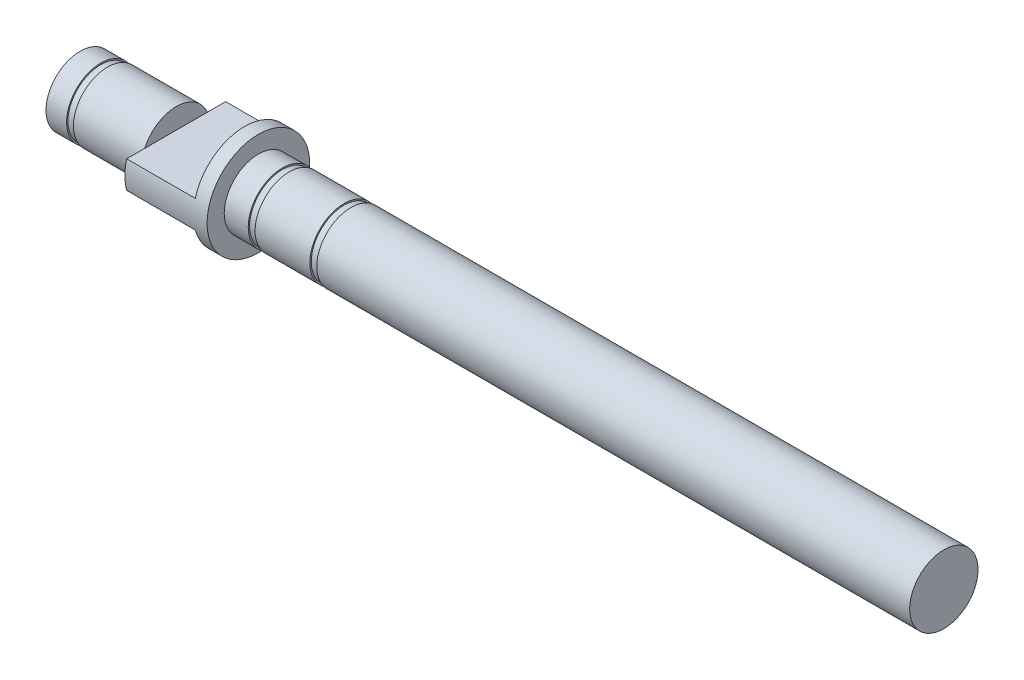
ISO-10303-21;
HEADER;
FILE_DESCRIPTION(('STEP AP214'),'2;1');
FILE_NAME('part.step','',(''),(''),'','','');
FILE_SCHEMA(('AUTOMOTIVE_DESIGN { 1 0 10303 214 1 1 1 1 }'));
ENDSEC;
DATA;
#1=APPLICATION_CONTEXT('core data for automotive mechanical design processes');
#2=APPLICATION_PROTOCOL_DEFINITION('international standard','automotive_design',2000,#1);
#3=PRODUCT_CONTEXT('',#1,'mechanical');
#4=PRODUCT('Part','Part','',(#3));
#5=PRODUCT_RELATED_PRODUCT_CATEGORY('part','',(#4));
#6=PRODUCT_DEFINITION_FORMATION('','',#4);
#7=PRODUCT_DEFINITION_CONTEXT('part definition',#1,'design');
#8=PRODUCT_DEFINITION('design','',#6,#7);
#9=PRODUCT_DEFINITION_SHAPE('','',#8);
#10=(LENGTH_UNIT() NAMED_UNIT(*) SI_UNIT(.MILLI.,.METRE.));
#11=(NAMED_UNIT(*) PLANE_ANGLE_UNIT() SI_UNIT($,.RADIAN.));
#12=(NAMED_UNIT(*) SI_UNIT($,.STERADIAN.) SOLID_ANGLE_UNIT());
#13=UNCERTAINTY_MEASURE_WITH_UNIT(LENGTH_MEASURE(1.E-05),#10,'distance_accuracy_value','');
#14=(GEOMETRIC_REPRESENTATION_CONTEXT(3) GLOBAL_UNCERTAINTY_ASSIGNED_CONTEXT((#13)) GLOBAL_UNIT_ASSIGNED_CONTEXT((#10,
#11,#12)) REPRESENTATION_CONTEXT('',''));
#15=CARTESIAN_POINT('',(0.,0.,0.));
#16=DIRECTION('',(0.,0.,1.));
#17=DIRECTION('',(1.,0.,0.));
#18=AXIS2_PLACEMENT_3D('',#15,#16,#17);
#19=CARTESIAN_POINT('',(14.,0.,-7.49));
#20=DIRECTION('',(1.,0.,0.));
#21=DIRECTION('',(0.,0.,-1.));
#22=AXIS2_PLACEMENT_3D('',#19,#20,#21);
#23=PLANE('',#22);
#24=CARTESIAN_POINT('',(14.,0.,0.));
#25=DIRECTION('',(-1.,0.,0.));
#26=DIRECTION('',(0.,0.,1.));
#27=AXIS2_PLACEMENT_3D('',#24,#25,#26);
#28=CIRCLE('',#27,7.49);
#29=CARTESIAN_POINT('',(14.,-2.,7.2180399001391));
#30=VERTEX_POINT('',#29);
#31=CARTESIAN_POINT('',(14.,2.,7.2180399001391));
#32=VERTEX_POINT('',#31);
#33=EDGE_CURVE('E117',#30,#32,#28,.T.);
#34=ORIENTED_EDGE('',*,*,#33,.T.);
#35=DIRECTION('',(0.,0.,1.));
#36=VECTOR('',#35,1.);
#37=CARTESIAN_POINT('',(14.,2.,7.22841614740048));
#38=LINE('',#37,#36);
#39=CARTESIAN_POINT('',(14.,2.,4.57166271721788));
#40=VERTEX_POINT('',#39);
#41=EDGE_CURVE('E122',#40,#32,#38,.T.);
#42=ORIENTED_EDGE('',*,*,#41,.F.);
#43=CARTESIAN_POINT('',(14.,0.,0.));
#44=DIRECTION('',(-1.,0.,0.));
#45=DIRECTION('',(0.,0.,1.));
#46=AXIS2_PLACEMENT_3D('',#43,#44,#45);
#47=CIRCLE('',#46,4.99);
#48=CARTESIAN_POINT('',(14.,-2.,4.57166271721789));
#49=VERTEX_POINT('',#48);
#50=EDGE_CURVE('E119',#49,#40,#47,.T.);
#51=ORIENTED_EDGE('',*,*,#50,.F.);
#52=DIRECTION('',(0.,0.,-1.));
#53=VECTOR('',#52,1.);
#54=CARTESIAN_POINT('',(14.,-2.,7.22841614740048));
#55=LINE('',#54,#53);
#56=EDGE_CURVE('E63',#30,#49,#55,.T.);
#57=ORIENTED_EDGE('',*,*,#56,.F.);
#58=EDGE_LOOP('',(#34,#42,#51,#57));
#59=FACE_BOUND('',#58,.T.);
#60=ADVANCED_FACE('F47',(#59),#23,.F.);
#61=CARTESIAN_POINT('',(0.,0.,-4.99));
#62=DIRECTION('',(1.,0.,0.));
#63=DIRECTION('',(0.,0.,-1.));
#64=AXIS2_PLACEMENT_3D('',#61,#62,#63);
#65=PLANE('',#64);
#66=CARTESIAN_POINT('',(0.,0.,0.));
#67=DIRECTION('',(-1.,0.,0.));
#68=DIRECTION('',(0.,0.,1.));
#69=AXIS2_PLACEMENT_3D('',#66,#67,#68);
#70=CIRCLE('',#69,4.99);
#71=CARTESIAN_POINT('',(0.,0.,4.99));
#72=VERTEX_POINT('',#71);
#73=EDGE_CURVE('E234',#72,#72,#70,.T.);
#74=ORIENTED_EDGE('',*,*,#73,.T.);
#75=EDGE_LOOP('',(#74));
#76=FACE_BOUND('',#75,.T.);
#77=ADVANCED_FACE('F49',(#76),#65,.F.);
#78=CARTESIAN_POINT('',(126.,0.,0.));
#79=DIRECTION('',(-1.,0.,0.));
#80=DIRECTION('',(0.,0.,1.));
#81=AXIS2_PLACEMENT_3D('',#78,#79,#80);
#82=PLANE('',#81);
#83=CARTESIAN_POINT('',(126.,0.,0.));
#84=DIRECTION('',(-1.,0.,0.));
#85=DIRECTION('',(0.,0.,1.));
#86=AXIS2_PLACEMENT_3D('',#83,#84,#85);
#87=CIRCLE('',#86,4.99000000000001);
#88=CARTESIAN_POINT('',(126.,0.,4.99000000000001));
#89=VERTEX_POINT('',#88);
#90=EDGE_CURVE('E183',#89,#89,#87,.T.);
#91=ORIENTED_EDGE('',*,*,#90,.F.);
#92=EDGE_LOOP('',(#91));
#93=FACE_BOUND('',#92,.T.);
#94=ADVANCED_FACE('F259',(#93),#82,.F.);
#95=CARTESIAN_POINT('',(0.,0.,0.));
#96=DIRECTION('',(-1.,0.,0.));
#97=DIRECTION('',(0.,0.,1.));
#98=AXIS2_PLACEMENT_3D('',#95,#96,#97);
#99=CYLINDRICAL_SURFACE('',#98,4.99000000000001);
#100=CARTESIAN_POINT('',(39.5,0.,0.));
#101=DIRECTION('',(-1.,0.,0.));
#102=DIRECTION('',(0.,0.,1.));
#103=AXIS2_PLACEMENT_3D('',#100,#101,#102);
#104=CIRCLE('',#103,4.99);
#105=CARTESIAN_POINT('',(39.5,0.,4.99));
#106=VERTEX_POINT('',#105);
#107=EDGE_CURVE('E179',#106,#106,#104,.T.);
#108=ORIENTED_EDGE('',*,*,#107,.F.);
#109=EDGE_LOOP('',(#108));
#110=FACE_BOUND('',#109,.T.);
#111=ORIENTED_EDGE('',*,*,#90,.T.);
#112=EDGE_LOOP('',(#111));
#113=FACE_BOUND('',#112,.T.);
#114=ADVANCED_FACE('F306',(#110,#113),#99,.T.);
#115=CARTESIAN_POINT('',(39.5,0.,-4.99));
#116=DIRECTION('',(1.,0.,0.));
#117=DIRECTION('',(0.,0.,-1.));
#118=AXIS2_PLACEMENT_3D('',#115,#116,#117);
#119=PLANE('',#118);
#120=CARTESIAN_POINT('',(39.5,0.,0.));
#121=DIRECTION('',(-1.,0.,0.));
#122=DIRECTION('',(0.,0.,1.));
#123=AXIS2_PLACEMENT_3D('',#120,#121,#122);
#124=CIRCLE('',#123,4.79000000000001);
#125=CARTESIAN_POINT('',(39.5,0.,4.79000000000001));
#126=VERTEX_POINT('',#125);
#127=EDGE_CURVE('E175',#126,#126,#124,.T.);
#128=ORIENTED_EDGE('',*,*,#127,.F.);
#129=EDGE_LOOP('',(#128));
#130=FACE_BOUND('',#129,.T.);
#131=ORIENTED_EDGE('',*,*,#107,.T.);
#132=EDGE_LOOP('',(#131));
#133=FACE_BOUND('',#132,.T.);
#134=ADVANCED_FACE('F302',(#130,#133),#119,.F.);
#135=CARTESIAN_POINT('',(0.,0.,0.));
#136=DIRECTION('',(-1.,0.,0.));
#137=DIRECTION('',(0.,0.,1.));
#138=AXIS2_PLACEMENT_3D('',#135,#136,#137);
#139=CYLINDRICAL_SURFACE('',#138,4.79000000000001);
#140=CARTESIAN_POINT('',(38.5,0.,0.));
#141=DIRECTION('',(-1.,0.,0.));
#142=DIRECTION('',(0.,0.,1.));
#143=AXIS2_PLACEMENT_3D('',#140,#141,#142);
#144=CIRCLE('',#143,4.79000000000001);
#145=CARTESIAN_POINT('',(38.5,0.,4.79000000000001));
#146=VERTEX_POINT('',#145);
#147=EDGE_CURVE('E171',#146,#146,#144,.T.);
#148=ORIENTED_EDGE('',*,*,#147,.F.);
#149=EDGE_LOOP('',(#148));
#150=FACE_BOUND('',#149,.T.);
#151=ORIENTED_EDGE('',*,*,#127,.T.);
#152=EDGE_LOOP('',(#151));
#153=FACE_BOUND('',#152,.T.);
#154=ADVANCED_FACE('F298',(#150,#153),#139,.T.);
#155=CARTESIAN_POINT('',(38.5,0.,-4.79000000000001));
#156=DIRECTION('',(-1.,0.,0.));
#157=DIRECTION('',(0.,0.,1.));
#158=AXIS2_PLACEMENT_3D('',#155,#156,#157);
#159=PLANE('',#158);
#160=CARTESIAN_POINT('',(38.5,0.,0.));
#161=DIRECTION('',(-1.,0.,0.));
#162=DIRECTION('',(0.,0.,1.));
#163=AXIS2_PLACEMENT_3D('',#160,#161,#162);
#164=CIRCLE('',#163,4.99);
#165=CARTESIAN_POINT('',(38.5,0.,4.99));
#166=VERTEX_POINT('',#165);
#167=EDGE_CURVE('E167',#166,#166,#164,.T.);
#168=ORIENTED_EDGE('',*,*,#167,.F.);
#169=EDGE_LOOP('',(#168));
#170=FACE_BOUND('',#169,.T.);
#171=ORIENTED_EDGE('',*,*,#147,.T.);
#172=EDGE_LOOP('',(#171));
#173=FACE_BOUND('',#172,.T.);
#174=ADVANCED_FACE('F294',(#170,#173),#159,.F.);
#175=CARTESIAN_POINT('',(0.,0.,0.));
#176=DIRECTION('',(-1.,0.,0.));
#177=DIRECTION('',(0.,0.,1.));
#178=AXIS2_PLACEMENT_3D('',#175,#176,#177);
#179=CYLINDRICAL_SURFACE('',#178,4.99);
#180=CARTESIAN_POINT('',(30.5,0.,0.));
#181=DIRECTION('',(-1.,0.,0.));
#182=DIRECTION('',(0.,0.,1.));
#183=AXIS2_PLACEMENT_3D('',#180,#181,#182);
#184=CIRCLE('',#183,4.99);
#185=CARTESIAN_POINT('',(30.5,0.,4.99));
#186=VERTEX_POINT('',#185);
#187=EDGE_CURVE('E163',#186,#186,#184,.T.);
#188=ORIENTED_EDGE('',*,*,#187,.F.);
#189=EDGE_LOOP('',(#188));
#190=FACE_BOUND('',#189,.T.);
#191=ORIENTED_EDGE('',*,*,#167,.T.);
#192=EDGE_LOOP('',(#191));
#193=FACE_BOUND('',#192,.T.);
#194=ADVANCED_FACE('F290',(#190,#193),#179,.T.);
#195=CARTESIAN_POINT('',(30.5,0.,-4.99));
#196=DIRECTION('',(1.,0.,0.));
#197=DIRECTION('',(0.,0.,-1.));
#198=AXIS2_PLACEMENT_3D('',#195,#196,#197);
#199=PLANE('',#198);
#200=CARTESIAN_POINT('',(30.5,0.,0.));
#201=DIRECTION('',(-1.,0.,0.));
#202=DIRECTION('',(0.,0.,1.));
#203=AXIS2_PLACEMENT_3D('',#200,#201,#202);
#204=CIRCLE('',#203,4.79000000000001);
#205=CARTESIAN_POINT('',(30.5,0.,4.79000000000001));
#206=VERTEX_POINT('',#205);
#207=EDGE_CURVE('E160',#206,#206,#204,.T.);
#208=ORIENTED_EDGE('',*,*,#207,.F.);
#209=EDGE_LOOP('',(#208));
#210=FACE_BOUND('',#209,.T.);
#211=ORIENTED_EDGE('',*,*,#187,.T.);
#212=EDGE_LOOP('',(#211));
#213=FACE_BOUND('',#212,.T.);
#214=ADVANCED_FACE('F286',(#210,#213),#199,.F.);
#215=CARTESIAN_POINT('',(0.,0.,0.));
#216=DIRECTION('',(-1.,0.,0.));
#217=DIRECTION('',(0.,0.,1.));
#218=AXIS2_PLACEMENT_3D('',#215,#216,#217);
#219=CYLINDRICAL_SURFACE('',#218,4.79000000000001);
#220=CARTESIAN_POINT('',(29.5,0.,0.));
#221=DIRECTION('',(-1.,0.,0.));
#222=DIRECTION('',(0.,0.,1.));
#223=AXIS2_PLACEMENT_3D('',#220,#221,#222);
#224=CIRCLE('',#223,4.79000000000001);
#225=CARTESIAN_POINT('',(29.5,0.,4.79000000000001));
#226=VERTEX_POINT('',#225);
#227=EDGE_CURVE('E156',#226,#226,#224,.T.);
#228=ORIENTED_EDGE('',*,*,#227,.F.);
#229=EDGE_LOOP('',(#228));
#230=FACE_BOUND('',#229,.T.);
#231=ORIENTED_EDGE('',*,*,#207,.T.);
#232=EDGE_LOOP('',(#231));
#233=FACE_BOUND('',#232,.T.);
#234=ADVANCED_FACE('F282',(#230,#233),#219,.T.);
#235=CARTESIAN_POINT('',(29.5,0.,-4.79000000000001));
#236=DIRECTION('',(-1.,0.,0.));
#237=DIRECTION('',(0.,0.,1.));
#238=AXIS2_PLACEMENT_3D('',#235,#236,#237);
#239=PLANE('',#238);
#240=CARTESIAN_POINT('',(29.5,0.,0.));
#241=DIRECTION('',(-1.,0.,0.));
#242=DIRECTION('',(0.,0.,1.));
#243=AXIS2_PLACEMENT_3D('',#240,#241,#242);
#244=CIRCLE('',#243,4.99);
#245=CARTESIAN_POINT('',(29.5,0.,4.99));
#246=VERTEX_POINT('',#245);
#247=EDGE_CURVE('E152',#246,#246,#244,.T.);
#248=ORIENTED_EDGE('',*,*,#247,.F.);
#249=EDGE_LOOP('',(#248));
#250=FACE_BOUND('',#249,.T.);
#251=ORIENTED_EDGE('',*,*,#227,.T.);
#252=EDGE_LOOP('',(#251));
#253=FACE_BOUND('',#252,.T.);
#254=ADVANCED_FACE('F278',(#250,#253),#239,.F.);
#255=CARTESIAN_POINT('',(0.,0.,0.));
#256=DIRECTION('',(-1.,0.,0.));
#257=DIRECTION('',(0.,0.,1.));
#258=AXIS2_PLACEMENT_3D('',#255,#256,#257);
#259=CYLINDRICAL_SURFACE('',#258,4.99);
#260=CARTESIAN_POINT('',(26.,0.,0.));
#261=DIRECTION('',(-1.,0.,0.));
#262=DIRECTION('',(0.,0.,1.));
#263=AXIS2_PLACEMENT_3D('',#260,#261,#262);
#264=CIRCLE('',#263,4.99);
#265=CARTESIAN_POINT('',(26.,0.,4.99));
#266=VERTEX_POINT('',#265);
#267=EDGE_CURVE('E148',#266,#266,#264,.T.);
#268=ORIENTED_EDGE('',*,*,#267,.F.);
#269=EDGE_LOOP('',(#268));
#270=FACE_BOUND('',#269,.T.);
#271=ORIENTED_EDGE('',*,*,#247,.T.);
#272=EDGE_LOOP('',(#271));
#273=FACE_BOUND('',#272,.T.);
#274=ADVANCED_FACE('F272',(#270,#273),#259,.T.);
#275=CARTESIAN_POINT('',(26.,0.,-4.99));
#276=DIRECTION('',(-1.,0.,0.));
#277=DIRECTION('',(0.,0.,1.));
#278=AXIS2_PLACEMENT_3D('',#275,#276,#277);
#279=PLANE('',#278);
#280=CARTESIAN_POINT('',(26.,0.,0.));
#281=DIRECTION('',(-1.,0.,0.));
#282=DIRECTION('',(0.,0.,1.));
#283=AXIS2_PLACEMENT_3D('',#280,#281,#282);
#284=CIRCLE('',#283,7.49);
#285=CARTESIAN_POINT('',(26.,0.,7.49));
#286=VERTEX_POINT('',#285);
#287=EDGE_CURVE('E138',#286,#286,#284,.T.);
#288=ORIENTED_EDGE('',*,*,#287,.F.);
#289=EDGE_LOOP('',(#288));
#290=FACE_BOUND('',#289,.T.);
#291=ORIENTED_EDGE('',*,*,#267,.T.);
#292=EDGE_LOOP('',(#291));
#293=FACE_BOUND('',#292,.T.);
#294=ADVANCED_FACE('F269',(#290,#293),#279,.F.);
#295=CARTESIAN_POINT('',(0.,0.,0.));
#296=DIRECTION('',(-1.,0.,0.));
#297=DIRECTION('',(0.,0.,1.));
#298=AXIS2_PLACEMENT_3D('',#295,#296,#297);
#299=CYLINDRICAL_SURFACE('',#298,7.49);
#300=CARTESIAN_POINT('',(24.,0.,0.));
#301=DIRECTION('',(1.,0.,0.));
#302=DIRECTION('',(0.,0.,-1.));
#303=AXIS2_PLACEMENT_3D('',#300,#301,#302);
#304=CIRCLE('',#303,7.49);
#305=CARTESIAN_POINT('',(24.,2.,-7.2180399001391));
#306=VERTEX_POINT('',#305);
#307=CARTESIAN_POINT('',(24.,2.,7.2180399001391));
#308=VERTEX_POINT('',#307);
#309=EDGE_CURVE('E11',#306,#308,#304,.T.);
#310=ORIENTED_EDGE('',*,*,#309,.T.);
#311=DIRECTION('',(-1.,0.,0.));
#312=VECTOR('',#311,1.);
#313=CARTESIAN_POINT('',(0.,2.,7.2180399001391));
#314=LINE('',#313,#312);
#315=EDGE_CURVE('E129',#308,#32,#314,.T.);
#316=ORIENTED_EDGE('',*,*,#315,.T.);
#317=ORIENTED_EDGE('',*,*,#33,.F.);
#318=DIRECTION('',(-1.,0.,0.));
#319=VECTOR('',#318,1.);
#320=CARTESIAN_POINT('',(0.,-2.,7.2180399001391));
#321=LINE('',#320,#319);
#322=CARTESIAN_POINT('',(24.,-2.,7.2180399001391));
#323=VERTEX_POINT('',#322);
#324=EDGE_CURVE('E102',#30,#323,#321,.F.);
#325=ORIENTED_EDGE('',*,*,#324,.T.);
#326=CARTESIAN_POINT('',(24.,0.,0.));
#327=DIRECTION('',(-1.,0.,0.));
#328=DIRECTION('',(0.,0.,1.));
#329=AXIS2_PLACEMENT_3D('',#326,#327,#328);
#330=CIRCLE('',#329,7.49);
#331=CARTESIAN_POINT('',(24.,-2.,-7.2180399001391));
#332=VERTEX_POINT('',#331);
#333=EDGE_CURVE('E56',#332,#323,#330,.T.);
#334=ORIENTED_EDGE('',*,*,#333,.F.);
#335=DIRECTION('',(-1.,0.,0.));
#336=VECTOR('',#335,1.);
#337=CARTESIAN_POINT('',(0.,-2.,-7.2180399001391));
#338=LINE('',#337,#336);
#339=CARTESIAN_POINT('',(14.,-2.,-7.2180399001391));
#340=VERTEX_POINT('',#339);
#341=EDGE_CURVE('E110',#332,#340,#338,.T.);
#342=ORIENTED_EDGE('',*,*,#341,.T.);
#343=CARTESIAN_POINT('',(14.,2.,-7.2180399001391));
#344=VERTEX_POINT('',#343);
#345=EDGE_CURVE('E131',#344,#340,#28,.T.);
#346=ORIENTED_EDGE('',*,*,#345,.F.);
#347=DIRECTION('',(-1.,0.,0.));
#348=VECTOR('',#347,1.);
#349=CARTESIAN_POINT('',(0.,2.,-7.2180399001391));
#350=LINE('',#349,#348);
#351=EDGE_CURVE('E193',#344,#306,#350,.F.);
#352=ORIENTED_EDGE('',*,*,#351,.T.);
#353=EDGE_LOOP('',(#310,#316,#317,#325,#334,#342,#346,#352));
#354=FACE_BOUND('',#353,.T.);
#355=ORIENTED_EDGE('',*,*,#287,.T.);
#356=EDGE_LOOP('',(#355));
#357=FACE_BOUND('',#356,.T.);
#358=ADVANCED_FACE('F127',(#354,#357),#299,.T.);
#359=CARTESIAN_POINT('',(14.,2.,-4.57166271721788));
#360=VERTEX_POINT('',#359);
#361=CARTESIAN_POINT('',(14.,-2.,-4.57166271721789));
#362=VERTEX_POINT('',#361);
#363=EDGE_CURVE('E141',#360,#362,#47,.T.);
#364=ORIENTED_EDGE('',*,*,#363,.F.);
#365=EDGE_CURVE('E71',#344,#360,#38,.T.);
#366=ORIENTED_EDGE('',*,*,#365,.F.);
#367=ORIENTED_EDGE('',*,*,#345,.T.);
#368=EDGE_CURVE('E125',#362,#340,#55,.T.);
#369=ORIENTED_EDGE('',*,*,#368,.F.);
#370=EDGE_LOOP('',(#364,#366,#367,#369));
#371=FACE_BOUND('',#370,.T.);
#372=ADVANCED_FACE('F198',(#371),#23,.F.);
#373=CARTESIAN_POINT('',(0.,0.,0.));
#374=DIRECTION('',(-1.,0.,0.));
#375=DIRECTION('',(0.,0.,1.));
#376=AXIS2_PLACEMENT_3D('',#373,#374,#375);
#377=CYLINDRICAL_SURFACE('',#376,4.99);
#378=CARTESIAN_POINT('',(4.,0.,0.));
#379=DIRECTION('',(-1.,0.,0.));
#380=DIRECTION('',(0.,0.,1.));
#381=AXIS2_PLACEMENT_3D('',#378,#379,#380);
#382=CIRCLE('',#381,4.99);
#383=CARTESIAN_POINT('',(4.,0.,4.99));
#384=VERTEX_POINT('',#383);
#385=EDGE_CURVE('E214',#384,#384,#382,.T.);
#386=ORIENTED_EDGE('',*,*,#385,.F.);
#387=EDGE_LOOP('',(#386));
#388=FACE_BOUND('',#387,.T.);
#389=EDGE_CURVE('E132',#40,#360,#47,.T.);
#390=ORIENTED_EDGE('',*,*,#389,.T.);
#391=ORIENTED_EDGE('',*,*,#363,.T.);
#392=EDGE_CURVE('E212',#362,#49,#47,.T.);
#393=ORIENTED_EDGE('',*,*,#392,.T.);
#394=ORIENTED_EDGE('',*,*,#50,.T.);
#395=EDGE_LOOP('',(#390,#391,#393,#394));
#396=FACE_BOUND('',#395,.T.);
#397=ADVANCED_FACE('F211',(#388,#396),#377,.T.);
#398=CARTESIAN_POINT('',(4.,0.,-4.99));
#399=DIRECTION('',(1.,0.,0.));
#400=DIRECTION('',(0.,0.,-1.));
#401=AXIS2_PLACEMENT_3D('',#398,#399,#400);
#402=PLANE('',#401);
#403=CARTESIAN_POINT('',(4.,0.,0.));
#404=DIRECTION('',(-1.,0.,0.));
#405=DIRECTION('',(0.,0.,1.));
#406=AXIS2_PLACEMENT_3D('',#403,#404,#405);
#407=CIRCLE('',#406,4.79);
#408=CARTESIAN_POINT('',(4.,0.,4.79));
#409=VERTEX_POINT('',#408);
#410=EDGE_CURVE('E218',#409,#409,#407,.T.);
#411=ORIENTED_EDGE('',*,*,#410,.F.);
#412=EDGE_LOOP('',(#411));
#413=FACE_BOUND('',#412,.T.);
#414=ORIENTED_EDGE('',*,*,#385,.T.);
#415=EDGE_LOOP('',(#414));
#416=FACE_BOUND('',#415,.T.);
#417=ADVANCED_FACE('F267',(#413,#416),#402,.F.);
#418=CARTESIAN_POINT('',(0.,0.,0.));
#419=DIRECTION('',(-1.,0.,0.));
#420=DIRECTION('',(0.,0.,1.));
#421=AXIS2_PLACEMENT_3D('',#418,#419,#420);
#422=CYLINDRICAL_SURFACE('',#421,4.79);
#423=CARTESIAN_POINT('',(3.,0.,0.));
#424=DIRECTION('',(-1.,0.,0.));
#425=DIRECTION('',(0.,0.,1.));
#426=AXIS2_PLACEMENT_3D('',#423,#424,#425);
#427=CIRCLE('',#426,4.79);
#428=CARTESIAN_POINT('',(3.,0.,4.79));
#429=VERTEX_POINT('',#428);
#430=EDGE_CURVE('E224',#429,#429,#427,.T.);
#431=ORIENTED_EDGE('',*,*,#430,.F.);
#432=EDGE_LOOP('',(#431));
#433=FACE_BOUND('',#432,.T.);
#434=ORIENTED_EDGE('',*,*,#410,.T.);
#435=EDGE_LOOP('',(#434));
#436=FACE_BOUND('',#435,.T.);
#437=ADVANCED_FACE('F357',(#433,#436),#422,.T.);
#438=CARTESIAN_POINT('',(3.,0.,-4.79));
#439=DIRECTION('',(-1.,0.,0.));
#440=DIRECTION('',(0.,0.,1.));
#441=AXIS2_PLACEMENT_3D('',#438,#439,#440);
#442=PLANE('',#441);
#443=CARTESIAN_POINT('',(3.,0.,0.));
#444=DIRECTION('',(-1.,0.,0.));
#445=DIRECTION('',(0.,0.,1.));
#446=AXIS2_PLACEMENT_3D('',#443,#444,#445);
#447=CIRCLE('',#446,4.99);
#448=CARTESIAN_POINT('',(3.,0.,4.99));
#449=VERTEX_POINT('',#448);
#450=EDGE_CURVE('E230',#449,#449,#447,.T.);
#451=ORIENTED_EDGE('',*,*,#450,.F.);
#452=EDGE_LOOP('',(#451));
#453=FACE_BOUND('',#452,.T.);
#454=ORIENTED_EDGE('',*,*,#430,.T.);
#455=EDGE_LOOP('',(#454));
#456=FACE_BOUND('',#455,.T.);
#457=ADVANCED_FACE('F368',(#453,#456),#442,.F.);
#458=CARTESIAN_POINT('',(0.,0.,0.));
#459=DIRECTION('',(-1.,0.,0.));
#460=DIRECTION('',(0.,0.,1.));
#461=AXIS2_PLACEMENT_3D('',#458,#459,#460);
#462=CYLINDRICAL_SURFACE('',#461,4.99);
#463=ORIENTED_EDGE('',*,*,#73,.F.);
#464=EDGE_LOOP('',(#463));
#465=FACE_BOUND('',#464,.T.);
#466=ORIENTED_EDGE('',*,*,#450,.T.);
#467=EDGE_LOOP('',(#466));
#468=FACE_BOUND('',#467,.T.);
#469=ADVANCED_FACE('F378',(#465,#468),#462,.T.);
#470=CARTESIAN_POINT('',(24.,0.,0.));
#471=DIRECTION('',(-1.,0.,0.));
#472=DIRECTION('',(0.,0.,1.));
#473=AXIS2_PLACEMENT_3D('',#470,#471,#472);
#474=PLANE('',#473);
#475=ORIENTED_EDGE('',*,*,#333,.T.);
#476=DIRECTION('',(0.,0.,-1.));
#477=VECTOR('',#476,1.);
#478=CARTESIAN_POINT('',(24.,-2.,7.22841614740048));
#479=LINE('',#478,#477);
#480=EDGE_CURVE('E105',#323,#332,#479,.T.);
#481=ORIENTED_EDGE('',*,*,#480,.T.);
#482=EDGE_LOOP('',(#475,#481));
#483=FACE_BOUND('',#482,.T.);
#484=ADVANCED_FACE('F188',(#483),#474,.T.);
#485=CARTESIAN_POINT('',(24.,-2.,7.22841614740048));
#486=DIRECTION('',(0.,1.,0.));
#487=DIRECTION('',(0.,0.,1.));
#488=AXIS2_PLACEMENT_3D('',#485,#486,#487);
#489=PLANE('',#488);
#490=ORIENTED_EDGE('',*,*,#480,.F.);
#491=ORIENTED_EDGE('',*,*,#324,.F.);
#492=ORIENTED_EDGE('',*,*,#56,.T.);
#493=EDGE_CURVE('E123',#49,#362,#55,.T.);
#494=ORIENTED_EDGE('',*,*,#493,.T.);
#495=ORIENTED_EDGE('',*,*,#368,.T.);
#496=ORIENTED_EDGE('',*,*,#341,.F.);
#497=EDGE_LOOP('',(#490,#491,#492,#494,#495,#496));
#498=FACE_BOUND('',#497,.T.);
#499=ADVANCED_FACE('F103',(#498),#489,.F.);
#500=CARTESIAN_POINT('',(14.,0.,0.));
#501=DIRECTION('',(-1.,0.,0.));
#502=DIRECTION('',(0.,0.,1.));
#503=AXIS2_PLACEMENT_3D('',#500,#501,#502);
#504=PLANE('',#503);
#505=ORIENTED_EDGE('',*,*,#493,.F.);
#506=ORIENTED_EDGE('',*,*,#392,.F.);
#507=EDGE_LOOP('',(#505,#506));
#508=FACE_BOUND('',#507,.T.);
#509=ADVANCED_FACE('F244',(#508),#504,.F.);
#510=CARTESIAN_POINT('',(24.,0.,0.));
#511=DIRECTION('',(1.,0.,0.));
#512=DIRECTION('',(0.,0.,-1.));
#513=AXIS2_PLACEMENT_3D('',#510,#511,#512);
#514=PLANE('',#513);
#515=DIRECTION('',(0.,0.,1.));
#516=VECTOR('',#515,1.);
#517=CARTESIAN_POINT('',(24.,2.,7.22841614740048));
#518=LINE('',#517,#516);
#519=EDGE_CURVE('E111',#306,#308,#518,.T.);
#520=ORIENTED_EDGE('',*,*,#519,.T.);
#521=ORIENTED_EDGE('',*,*,#309,.F.);
#522=EDGE_LOOP('',(#520,#521));
#523=FACE_BOUND('',#522,.T.);
#524=ADVANCED_FACE('F246',(#523),#514,.F.);
#525=CARTESIAN_POINT('',(24.,2.,7.22841614740048));
#526=DIRECTION('',(0.,-1.,0.));
#527=DIRECTION('',(0.,0.,-1.));
#528=AXIS2_PLACEMENT_3D('',#525,#526,#527);
#529=PLANE('',#528);
#530=ORIENTED_EDGE('',*,*,#519,.F.);
#531=ORIENTED_EDGE('',*,*,#351,.F.);
#532=ORIENTED_EDGE('',*,*,#365,.T.);
#533=EDGE_CURVE('E201',#360,#40,#38,.T.);
#534=ORIENTED_EDGE('',*,*,#533,.T.);
#535=ORIENTED_EDGE('',*,*,#41,.T.);
#536=ORIENTED_EDGE('',*,*,#315,.F.);
#537=EDGE_LOOP('',(#530,#531,#532,#534,#535,#536));
#538=FACE_BOUND('',#537,.T.);
#539=ADVANCED_FACE('F209',(#538),#529,.F.);
#540=CARTESIAN_POINT('',(14.,0.,0.));
#541=DIRECTION('',(1.,0.,0.));
#542=DIRECTION('',(0.,0.,-1.));
#543=AXIS2_PLACEMENT_3D('',#540,#541,#542);
#544=PLANE('',#543);
#545=ORIENTED_EDGE('',*,*,#389,.F.);
#546=ORIENTED_EDGE('',*,*,#533,.F.);
#547=EDGE_LOOP('',(#545,#546));
#548=FACE_BOUND('',#547,.T.);
#549=ADVANCED_FACE('F439',(#548),#544,.T.);
#550=CLOSED_SHELL('',(#60,#77,#94,#114,#134,#154,#174,#194,#214,#234,#254,#274,#294,#358,#372,
#397,#417,#437,#457,#469,#484,#499,#509,#524,#539,#549));
#551=MANIFOLD_SOLID_BREP('B2',#550);
#552=ADVANCED_BREP_SHAPE_REPRESENTATION('',(#18,#551),#14);
#553=SHAPE_DEFINITION_REPRESENTATION(#9,#552);
ENDSEC;
END-ISO-10303-21;
